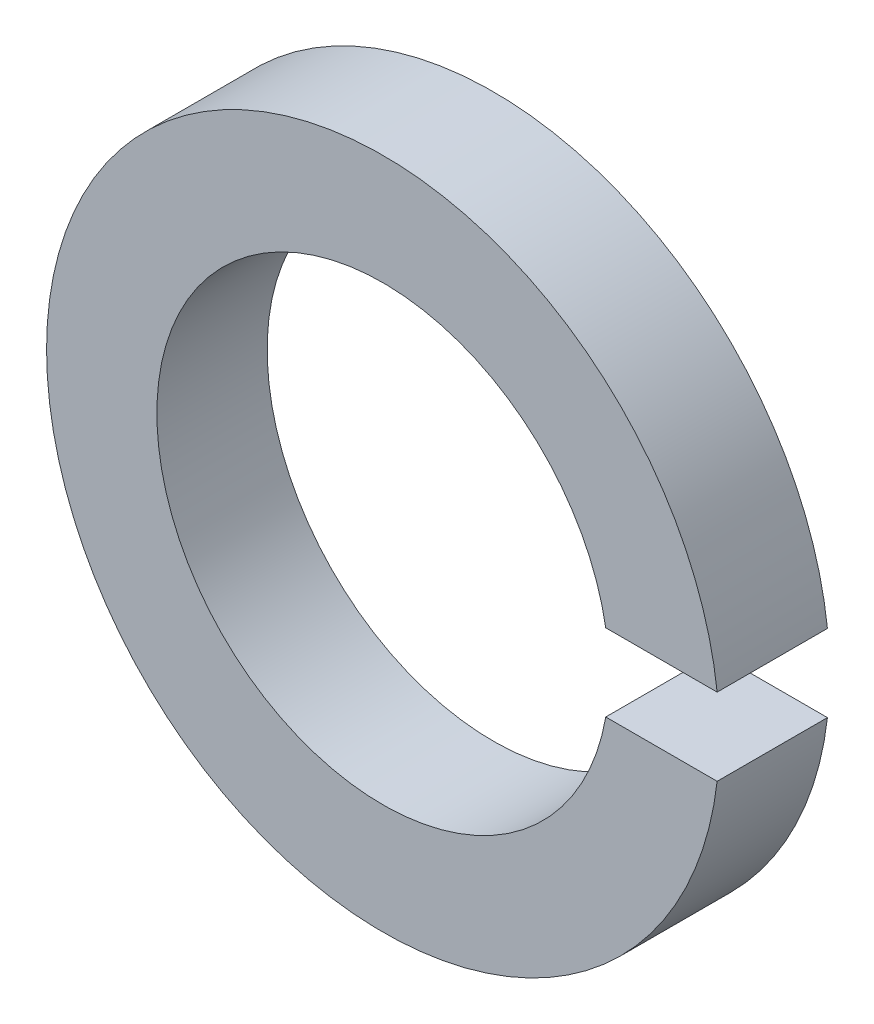
ISO-10303-21;
HEADER;
FILE_DESCRIPTION(('STEP AP214'),'2;1');
FILE_NAME('part.step','',(''),(''),'','','');
FILE_SCHEMA(('AUTOMOTIVE_DESIGN { 1 0 10303 214 1 1 1 1 }'));
ENDSEC;
DATA;
#1=APPLICATION_CONTEXT('core data for automotive mechanical design processes');
#2=APPLICATION_PROTOCOL_DEFINITION('international standard','automotive_design',2000,#1);
#3=PRODUCT_CONTEXT('',#1,'mechanical');
#4=PRODUCT('Part','Part','',(#3));
#5=PRODUCT_RELATED_PRODUCT_CATEGORY('part','',(#4));
#6=PRODUCT_DEFINITION_FORMATION('','',#4);
#7=PRODUCT_DEFINITION_CONTEXT('part definition',#1,'design');
#8=PRODUCT_DEFINITION('design','',#6,#7);
#9=PRODUCT_DEFINITION_SHAPE('','',#8);
#10=(LENGTH_UNIT() NAMED_UNIT(*) SI_UNIT(.MILLI.,.METRE.));
#11=(NAMED_UNIT(*) PLANE_ANGLE_UNIT() SI_UNIT($,.RADIAN.));
#12=(NAMED_UNIT(*) SI_UNIT($,.STERADIAN.) SOLID_ANGLE_UNIT());
#13=UNCERTAINTY_MEASURE_WITH_UNIT(LENGTH_MEASURE(1.E-05),#10,'distance_accuracy_value','');
#14=(GEOMETRIC_REPRESENTATION_CONTEXT(3) GLOBAL_UNCERTAINTY_ASSIGNED_CONTEXT((#13)) GLOBAL_UNIT_ASSIGNED_CONTEXT((#10,
#11,#12)) REPRESENTATION_CONTEXT('',''));
#15=CARTESIAN_POINT('',(0.,0.,0.));
#16=DIRECTION('',(0.,0.,1.));
#17=DIRECTION('',(1.,0.,0.));
#18=AXIS2_PLACEMENT_3D('',#15,#16,#17);
#19=CARTESIAN_POINT('',(0.,0.,2.));
#20=DIRECTION('',(0.,0.,1.));
#21=DIRECTION('',(1.,0.,0.));
#22=AXIS2_PLACEMENT_3D('',#19,#20,#21);
#23=PLANE('',#22);
#24=DIRECTION('',(-1.,0.,0.));
#25=VECTOR('',#24,1.);
#26=CARTESIAN_POINT('',(3.96007768204085,0.7,2.));
#27=LINE('',#26,#25);
#28=CARTESIAN_POINT('',(6.05970296301725,0.7,2.));
#29=VERTEX_POINT('',#28);
#30=CARTESIAN_POINT('',(4.03980197534483,0.7,2.));
#31=VERTEX_POINT('',#30);
#32=EDGE_CURVE('E51',#29,#31,#27,.T.);
#33=ORIENTED_EDGE('',*,*,#32,.F.);
#34=CARTESIAN_POINT('',(0.,0.,2.));
#35=DIRECTION('',(0.,0.,1.));
#36=DIRECTION('',(1.,0.,0.));
#37=AXIS2_PLACEMENT_3D('',#34,#35,#36);
#38=CIRCLE('',#37,6.1);
#39=CARTESIAN_POINT('',(6.05970296301725,-0.7,2.));
#40=VERTEX_POINT('',#39);
#41=EDGE_CURVE('E74',#29,#40,#38,.T.);
#42=ORIENTED_EDGE('',*,*,#41,.T.);
#43=DIRECTION('',(1.,0.,0.));
#44=VECTOR('',#43,1.);
#45=CARTESIAN_POINT('',(3.96007768204085,-0.7,2.));
#46=LINE('',#45,#44);
#47=CARTESIAN_POINT('',(4.03980197534483,-0.7,2.));
#48=VERTEX_POINT('',#47);
#49=EDGE_CURVE('E68',#48,#40,#46,.T.);
#50=ORIENTED_EDGE('',*,*,#49,.F.);
#51=CARTESIAN_POINT('',(0.,0.,2.));
#52=DIRECTION('',(0.,0.,1.));
#53=DIRECTION('',(1.,0.,0.));
#54=AXIS2_PLACEMENT_3D('',#51,#52,#53);
#55=CIRCLE('',#54,4.1);
#56=EDGE_CURVE('E78',#31,#48,#55,.T.);
#57=ORIENTED_EDGE('',*,*,#56,.F.);
#58=EDGE_LOOP('',(#33,#42,#50,#57));
#59=FACE_BOUND('',#58,.T.);
#60=ADVANCED_FACE('F29',(#59),#23,.T.);
#61=CARTESIAN_POINT('',(0.,0.,0.));
#62=DIRECTION('',(0.,0.,1.));
#63=DIRECTION('',(1.,0.,0.));
#64=AXIS2_PLACEMENT_3D('',#61,#62,#63);
#65=PLANE('',#64);
#66=CARTESIAN_POINT('',(0.,0.,0.));
#67=DIRECTION('',(0.,0.,1.));
#68=DIRECTION('',(1.,0.,0.));
#69=AXIS2_PLACEMENT_3D('',#66,#67,#68);
#70=CIRCLE('',#69,6.1);
#71=CARTESIAN_POINT('',(6.05970296301725,0.7,0.));
#72=VERTEX_POINT('',#71);
#73=CARTESIAN_POINT('',(6.05970296301725,-0.7,0.));
#74=VERTEX_POINT('',#73);
#75=EDGE_CURVE('E82',#72,#74,#70,.T.);
#76=ORIENTED_EDGE('',*,*,#75,.F.);
#77=DIRECTION('',(-1.,0.,0.));
#78=VECTOR('',#77,1.);
#79=CARTESIAN_POINT('',(3.96007768204085,0.7,0.));
#80=LINE('',#79,#78);
#81=CARTESIAN_POINT('',(4.03980197534483,0.7,0.));
#82=VERTEX_POINT('',#81);
#83=EDGE_CURVE('E95',#72,#82,#80,.T.);
#84=ORIENTED_EDGE('',*,*,#83,.T.);
#85=CARTESIAN_POINT('',(0.,0.,0.));
#86=DIRECTION('',(0.,0.,1.));
#87=DIRECTION('',(1.,0.,0.));
#88=AXIS2_PLACEMENT_3D('',#85,#86,#87);
#89=CIRCLE('',#88,4.1);
#90=CARTESIAN_POINT('',(4.03980197534483,-0.7,0.));
#91=VERTEX_POINT('',#90);
#92=EDGE_CURVE('E83',#82,#91,#89,.T.);
#93=ORIENTED_EDGE('',*,*,#92,.T.);
#94=DIRECTION('',(1.,0.,0.));
#95=VECTOR('',#94,1.);
#96=CARTESIAN_POINT('',(3.96007768204085,-0.7,0.));
#97=LINE('',#96,#95);
#98=EDGE_CURVE('E44',#91,#74,#97,.T.);
#99=ORIENTED_EDGE('',*,*,#98,.T.);
#100=EDGE_LOOP('',(#76,#84,#93,#99));
#101=FACE_BOUND('',#100,.T.);
#102=ADVANCED_FACE('F101',(#101),#65,.F.);
#103=CARTESIAN_POINT('',(0.,0.,2.));
#104=DIRECTION('',(0.,0.,-1.));
#105=DIRECTION('',(-1.,0.,0.));
#106=AXIS2_PLACEMENT_3D('',#103,#104,#105);
#107=CYLINDRICAL_SURFACE('',#106,6.1);
#108=ORIENTED_EDGE('',*,*,#41,.F.);
#109=DIRECTION('',(0.,0.,-1.));
#110=VECTOR('',#109,1.);
#111=CARTESIAN_POINT('',(6.05970296301725,0.7,2.));
#112=LINE('',#111,#110);
#113=EDGE_CURVE('E87',#29,#72,#112,.T.);
#114=ORIENTED_EDGE('',*,*,#113,.T.);
#115=ORIENTED_EDGE('',*,*,#75,.T.);
#116=DIRECTION('',(0.,0.,-1.));
#117=VECTOR('',#116,1.);
#118=CARTESIAN_POINT('',(6.05970296301725,-0.7,2.));
#119=LINE('',#118,#117);
#120=EDGE_CURVE('E93',#74,#40,#119,.F.);
#121=ORIENTED_EDGE('',*,*,#120,.T.);
#122=EDGE_LOOP('',(#108,#114,#115,#121));
#123=FACE_BOUND('',#122,.T.);
#124=ADVANCED_FACE('F31',(#123),#107,.T.);
#125=CARTESIAN_POINT('',(0.,0.,2.));
#126=DIRECTION('',(0.,0.,-1.));
#127=DIRECTION('',(-1.,0.,0.));
#128=AXIS2_PLACEMENT_3D('',#125,#126,#127);
#129=CYLINDRICAL_SURFACE('',#128,4.1);
#130=DIRECTION('',(0.,0.,-1.));
#131=VECTOR('',#130,1.);
#132=CARTESIAN_POINT('',(4.03980197534483,0.7,2.));
#133=LINE('',#132,#131);
#134=EDGE_CURVE('E11',#31,#82,#133,.T.);
#135=ORIENTED_EDGE('',*,*,#134,.F.);
#136=ORIENTED_EDGE('',*,*,#56,.T.);
#137=DIRECTION('',(0.,0.,-1.));
#138=VECTOR('',#137,1.);
#139=CARTESIAN_POINT('',(4.03980197534483,-0.7,2.));
#140=LINE('',#139,#138);
#141=EDGE_CURVE('E37',#91,#48,#140,.F.);
#142=ORIENTED_EDGE('',*,*,#141,.F.);
#143=ORIENTED_EDGE('',*,*,#92,.F.);
#144=EDGE_LOOP('',(#135,#136,#142,#143));
#145=FACE_BOUND('',#144,.T.);
#146=ADVANCED_FACE('F81',(#145),#129,.F.);
#147=CARTESIAN_POINT('',(3.96007768204085,-0.7,0.));
#148=DIRECTION('',(0.,-1.,0.));
#149=DIRECTION('',(0.,0.,-1.));
#150=AXIS2_PLACEMENT_3D('',#147,#148,#149);
#151=PLANE('',#150);
#152=ORIENTED_EDGE('',*,*,#98,.F.);
#153=ORIENTED_EDGE('',*,*,#141,.T.);
#154=ORIENTED_EDGE('',*,*,#49,.T.);
#155=ORIENTED_EDGE('',*,*,#120,.F.);
#156=EDGE_LOOP('',(#152,#153,#154,#155));
#157=FACE_BOUND('',#156,.T.);
#158=ADVANCED_FACE('F67',(#157),#151,.F.);
#159=CARTESIAN_POINT('',(3.96007768204085,0.7,0.));
#160=DIRECTION('',(0.,1.,0.));
#161=DIRECTION('',(0.,0.,1.));
#162=AXIS2_PLACEMENT_3D('',#159,#160,#161);
#163=PLANE('',#162);
#164=ORIENTED_EDGE('',*,*,#32,.T.);
#165=ORIENTED_EDGE('',*,*,#134,.T.);
#166=ORIENTED_EDGE('',*,*,#83,.F.);
#167=ORIENTED_EDGE('',*,*,#113,.F.);
#168=EDGE_LOOP('',(#164,#165,#166,#167));
#169=FACE_BOUND('',#168,.T.);
#170=ADVANCED_FACE('F103',(#169),#163,.F.);
#171=CLOSED_SHELL('',(#60,#102,#124,#146,#158,#170));
#172=MANIFOLD_SOLID_BREP('B2',#171);
#173=ADVANCED_BREP_SHAPE_REPRESENTATION('',(#18,#172),#14);
#174=SHAPE_DEFINITION_REPRESENTATION(#9,#173);
ENDSEC;
END-ISO-10303-21;
